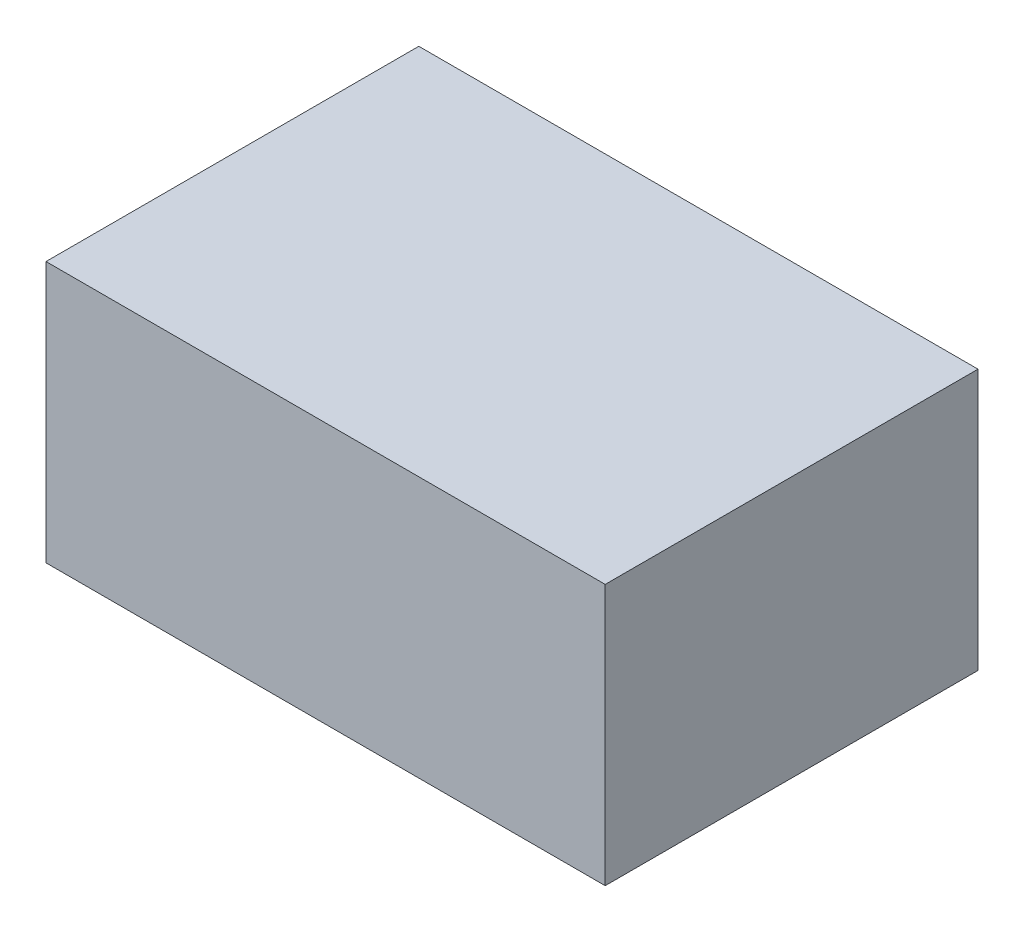
ISO-10303-21;
HEADER;
FILE_DESCRIPTION(('STEP AP214'),'2;1');
FILE_NAME('part.step','',(''),(''),'','','');
FILE_SCHEMA(('AUTOMOTIVE_DESIGN { 1 0 10303 214 1 1 1 1 }'));
ENDSEC;
DATA;
#1=APPLICATION_CONTEXT('core data for automotive mechanical design processes');
#2=APPLICATION_PROTOCOL_DEFINITION('international standard','automotive_design',2000,#1);
#3=PRODUCT_CONTEXT('',#1,'mechanical');
#4=PRODUCT('Part','Part','',(#3));
#5=PRODUCT_RELATED_PRODUCT_CATEGORY('part','',(#4));
#6=PRODUCT_DEFINITION_FORMATION('','',#4);
#7=PRODUCT_DEFINITION_CONTEXT('part definition',#1,'design');
#8=PRODUCT_DEFINITION('design','',#6,#7);
#9=PRODUCT_DEFINITION_SHAPE('','',#8);
#10=(LENGTH_UNIT() NAMED_UNIT(*) SI_UNIT(.MILLI.,.METRE.));
#11=(NAMED_UNIT(*) PLANE_ANGLE_UNIT() SI_UNIT($,.RADIAN.));
#12=(NAMED_UNIT(*) SI_UNIT($,.STERADIAN.) SOLID_ANGLE_UNIT());
#13=UNCERTAINTY_MEASURE_WITH_UNIT(LENGTH_MEASURE(1.E-05),#10,'distance_accuracy_value','');
#14=(GEOMETRIC_REPRESENTATION_CONTEXT(3) GLOBAL_UNCERTAINTY_ASSIGNED_CONTEXT((#13)) GLOBAL_UNIT_ASSIGNED_CONTEXT((#10,
#11,#12)) REPRESENTATION_CONTEXT('',''));
#15=CARTESIAN_POINT('',(0.,0.,0.));
#16=DIRECTION('',(0.,0.,1.));
#17=DIRECTION('',(1.,0.,0.));
#18=AXIS2_PLACEMENT_3D('',#15,#16,#17);
#19=CARTESIAN_POINT('',(-67.6866359447006,658.117273160655,1000.));
#20=DIRECTION('',(1.,0.,0.));
#21=DIRECTION('',(0.,1.,0.));
#22=AXIS2_PLACEMENT_3D('',#19,#20,#21);
#23=PLANE('',#22);
#24=DIRECTION('',(0.,-1.,0.));
#25=VECTOR('',#24,1.);
#26=CARTESIAN_POINT('',(-67.6866359447006,658.117273160655,0.));
#27=LINE('',#26,#25);
#28=CARTESIAN_POINT('',(-67.6866359447006,658.117273160655,0.));
#29=VERTEX_POINT('',#28);
#30=CARTESIAN_POINT('',(-67.6866359447005,-41.8827268393453,0.));
#31=VERTEX_POINT('',#30);
#32=EDGE_CURVE('E98',#29,#31,#27,.T.);
#33=ORIENTED_EDGE('',*,*,#32,.T.);
#34=DIRECTION('',(0.,0.,-1.));
#35=VECTOR('',#34,1.);
#36=CARTESIAN_POINT('',(-67.6866359447005,-41.8827268393453,1000.));
#37=LINE('',#36,#35);
#38=CARTESIAN_POINT('',(-67.6866359447005,-41.8827268393453,1000.));
#39=VERTEX_POINT('',#38);
#40=EDGE_CURVE('E11',#39,#31,#37,.T.);
#41=ORIENTED_EDGE('',*,*,#40,.F.);
#42=DIRECTION('',(0.,-1.,0.));
#43=VECTOR('',#42,1.);
#44=CARTESIAN_POINT('',(-67.6866359447006,658.117273160655,1000.));
#45=LINE('',#44,#43);
#46=CARTESIAN_POINT('',(-67.6866359447006,658.117273160655,1000.));
#47=VERTEX_POINT('',#46);
#48=EDGE_CURVE('E86',#47,#39,#45,.T.);
#49=ORIENTED_EDGE('',*,*,#48,.F.);
#50=DIRECTION('',(0.,0.,-1.));
#51=VECTOR('',#50,1.);
#52=CARTESIAN_POINT('',(-67.6866359447006,658.117273160655,1000.));
#53=LINE('',#52,#51);
#54=EDGE_CURVE('E94',#47,#29,#53,.T.);
#55=ORIENTED_EDGE('',*,*,#54,.T.);
#56=EDGE_LOOP('',(#33,#41,#49,#55));
#57=FACE_BOUND('',#56,.T.);
#58=ADVANCED_FACE('F35',(#57),#23,.F.);
#59=CARTESIAN_POINT('',(-67.6866359447005,-41.8827268393453,1000.));
#60=DIRECTION('',(0.,1.,0.));
#61=DIRECTION('',(0.,0.,1.));
#62=AXIS2_PLACEMENT_3D('',#59,#60,#61);
#63=PLANE('',#62);
#64=DIRECTION('',(1.,0.,0.));
#65=VECTOR('',#64,1.);
#66=CARTESIAN_POINT('',(-67.6866359447005,-41.8827268393453,0.));
#67=LINE('',#66,#65);
#68=CARTESIAN_POINT('',(1432.3133640553,-41.8827268393453,0.));
#69=VERTEX_POINT('',#68);
#70=EDGE_CURVE('E90',#31,#69,#67,.T.);
#71=ORIENTED_EDGE('',*,*,#70,.T.);
#72=DIRECTION('',(0.,0.,-1.));
#73=VECTOR('',#72,1.);
#74=CARTESIAN_POINT('',(1432.3133640553,-41.8827268393453,1000.));
#75=LINE('',#74,#73);
#76=CARTESIAN_POINT('',(1432.3133640553,-41.8827268393453,1000.));
#77=VERTEX_POINT('',#76);
#78=EDGE_CURVE('E43',#77,#69,#75,.T.);
#79=ORIENTED_EDGE('',*,*,#78,.F.);
#80=DIRECTION('',(1.,0.,0.));
#81=VECTOR('',#80,1.);
#82=CARTESIAN_POINT('',(-67.6866359447005,-41.8827268393453,1000.));
#83=LINE('',#82,#81);
#84=EDGE_CURVE('E81',#39,#77,#83,.T.);
#85=ORIENTED_EDGE('',*,*,#84,.F.);
#86=ORIENTED_EDGE('',*,*,#40,.T.);
#87=EDGE_LOOP('',(#71,#79,#85,#86));
#88=FACE_BOUND('',#87,.T.);
#89=ADVANCED_FACE('F89',(#88),#63,.F.);
#90=CARTESIAN_POINT('',(1432.3133640553,658.117273160655,1000.));
#91=DIRECTION('',(-1.,0.,0.));
#92=DIRECTION('',(0.,-1.,0.));
#93=AXIS2_PLACEMENT_3D('',#90,#91,#92);
#94=PLANE('',#93);
#95=DIRECTION('',(0.,1.,0.));
#96=VECTOR('',#95,1.);
#97=CARTESIAN_POINT('',(1432.3133640553,658.117273160655,0.));
#98=LINE('',#97,#96);
#99=CARTESIAN_POINT('',(1432.3133640553,658.117273160655,0.));
#100=VERTEX_POINT('',#99);
#101=EDGE_CURVE('E68',#69,#100,#98,.T.);
#102=ORIENTED_EDGE('',*,*,#101,.T.);
#103=DIRECTION('',(0.,0.,-1.));
#104=VECTOR('',#103,1.);
#105=CARTESIAN_POINT('',(1432.3133640553,658.117273160655,1000.));
#106=LINE('',#105,#104);
#107=CARTESIAN_POINT('',(1432.3133640553,658.117273160655,1000.));
#108=VERTEX_POINT('',#107);
#109=EDGE_CURVE('E91',#108,#100,#106,.T.);
#110=ORIENTED_EDGE('',*,*,#109,.F.);
#111=DIRECTION('',(0.,1.,0.));
#112=VECTOR('',#111,1.);
#113=CARTESIAN_POINT('',(1432.3133640553,658.117273160655,1000.));
#114=LINE('',#113,#112);
#115=EDGE_CURVE('E84',#77,#108,#114,.T.);
#116=ORIENTED_EDGE('',*,*,#115,.F.);
#117=ORIENTED_EDGE('',*,*,#78,.T.);
#118=EDGE_LOOP('',(#102,#110,#116,#117));
#119=FACE_BOUND('',#118,.T.);
#120=ADVANCED_FACE('F92',(#119),#94,.F.);
#121=CARTESIAN_POINT('',(-67.6866359447006,658.117273160655,1000.));
#122=DIRECTION('',(0.,-1.,0.));
#123=DIRECTION('',(0.,0.,-1.));
#124=AXIS2_PLACEMENT_3D('',#121,#122,#123);
#125=PLANE('',#124);
#126=DIRECTION('',(-1.,0.,0.));
#127=VECTOR('',#126,1.);
#128=CARTESIAN_POINT('',(-67.6866359447006,658.117273160655,0.));
#129=LINE('',#128,#127);
#130=EDGE_CURVE('E74',#100,#29,#129,.T.);
#131=ORIENTED_EDGE('',*,*,#130,.T.);
#132=ORIENTED_EDGE('',*,*,#54,.F.);
#133=DIRECTION('',(-1.,0.,0.));
#134=VECTOR('',#133,1.);
#135=CARTESIAN_POINT('',(-67.6866359447006,658.117273160655,1000.));
#136=LINE('',#135,#134);
#137=EDGE_CURVE('E51',#108,#47,#136,.T.);
#138=ORIENTED_EDGE('',*,*,#137,.F.);
#139=ORIENTED_EDGE('',*,*,#109,.T.);
#140=EDGE_LOOP('',(#131,#132,#138,#139));
#141=FACE_BOUND('',#140,.T.);
#142=ADVANCED_FACE('F105',(#141),#125,.F.);
#143=CARTESIAN_POINT('',(0.,0.,1000.));
#144=DIRECTION('',(0.,0.,1.));
#145=DIRECTION('',(1.,0.,0.));
#146=AXIS2_PLACEMENT_3D('',#143,#144,#145);
#147=PLANE('',#146);
#148=ORIENTED_EDGE('',*,*,#48,.T.);
#149=ORIENTED_EDGE('',*,*,#84,.T.);
#150=ORIENTED_EDGE('',*,*,#115,.T.);
#151=ORIENTED_EDGE('',*,*,#137,.T.);
#152=EDGE_LOOP('',(#148,#149,#150,#151));
#153=FACE_BOUND('',#152,.T.);
#154=ADVANCED_FACE('F82',(#153),#147,.T.);
#155=CARTESIAN_POINT('',(0.,0.,0.));
#156=DIRECTION('',(0.,0.,1.));
#157=DIRECTION('',(1.,0.,0.));
#158=AXIS2_PLACEMENT_3D('',#155,#156,#157);
#159=PLANE('',#158);
#160=ORIENTED_EDGE('',*,*,#32,.F.);
#161=ORIENTED_EDGE('',*,*,#130,.F.);
#162=ORIENTED_EDGE('',*,*,#101,.F.);
#163=ORIENTED_EDGE('',*,*,#70,.F.);
#164=EDGE_LOOP('',(#160,#161,#162,#163));
#165=FACE_BOUND('',#164,.T.);
#166=ADVANCED_FACE('F108',(#165),#159,.F.);
#167=CLOSED_SHELL('',(#58,#89,#120,#142,#154,#166));
#168=MANIFOLD_SOLID_BREP('B2',#167);
#169=ADVANCED_BREP_SHAPE_REPRESENTATION('',(#18,#168),#14);
#170=SHAPE_DEFINITION_REPRESENTATION(#9,#169);
ENDSEC;
END-ISO-10303-21;
